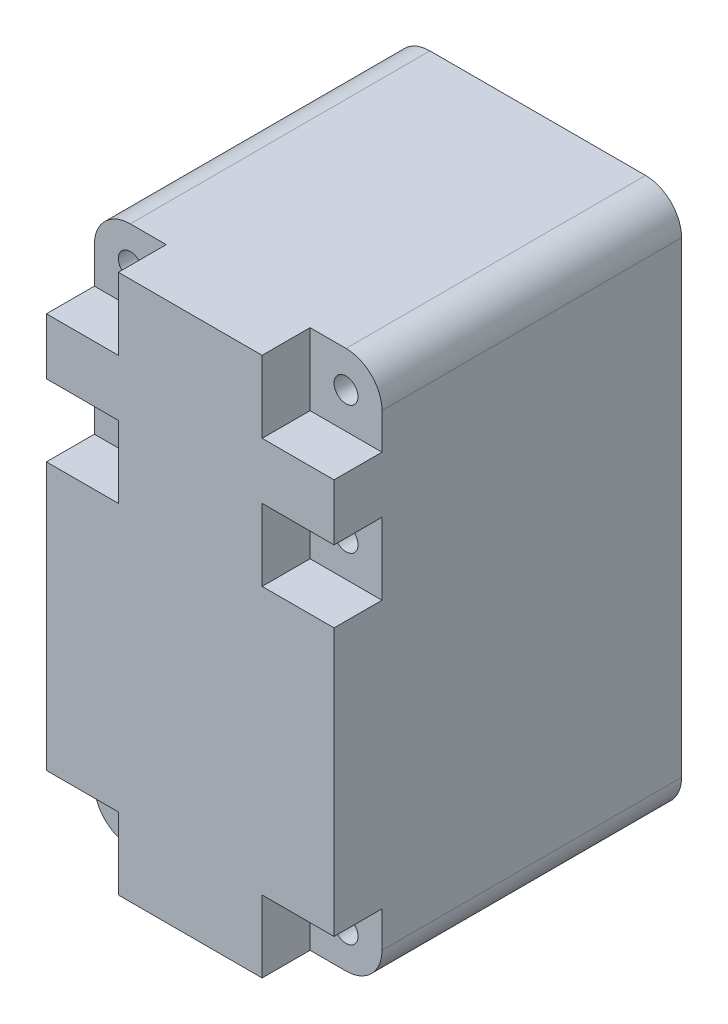
ISO-10303-21;
HEADER;
FILE_DESCRIPTION(('STEP AP214'),'2;1');
FILE_NAME('part.step','',(''),(''),'','','');
FILE_SCHEMA(('AUTOMOTIVE_DESIGN { 1 0 10303 214 1 1 1 1 }'));
ENDSEC;
DATA;
#1=APPLICATION_CONTEXT('core data for automotive mechanical design processes');
#2=APPLICATION_PROTOCOL_DEFINITION('international standard','automotive_design',2000,#1);
#3=PRODUCT_CONTEXT('',#1,'mechanical');
#4=PRODUCT('Part','Part','',(#3));
#5=PRODUCT_RELATED_PRODUCT_CATEGORY('part','',(#4));
#6=PRODUCT_DEFINITION_FORMATION('','',#4);
#7=PRODUCT_DEFINITION_CONTEXT('part definition',#1,'design');
#8=PRODUCT_DEFINITION('design','',#6,#7);
#9=PRODUCT_DEFINITION_SHAPE('','',#8);
#10=(LENGTH_UNIT() NAMED_UNIT(*) SI_UNIT(.MILLI.,.METRE.));
#11=(NAMED_UNIT(*) PLANE_ANGLE_UNIT() SI_UNIT($,.RADIAN.));
#12=(NAMED_UNIT(*) SI_UNIT($,.STERADIAN.) SOLID_ANGLE_UNIT());
#13=UNCERTAINTY_MEASURE_WITH_UNIT(LENGTH_MEASURE(1.E-05),#10,'distance_accuracy_value','');
#14=(GEOMETRIC_REPRESENTATION_CONTEXT(3) GLOBAL_UNCERTAINTY_ASSIGNED_CONTEXT((#13)) GLOBAL_UNIT_ASSIGNED_CONTEXT((#10,
#11,#12)) REPRESENTATION_CONTEXT('',''));
#15=CARTESIAN_POINT('',(0.,0.,0.));
#16=DIRECTION('',(0.,0.,1.));
#17=DIRECTION('',(1.,0.,0.));
#18=AXIS2_PLACEMENT_3D('',#15,#16,#17);
#19=CARTESIAN_POINT('',(-9.,-19.5,14.5));
#20=DIRECTION('',(0.,0.,-1.));
#21=DIRECTION('',(-1.,0.,0.));
#22=AXIS2_PLACEMENT_3D('',#19,#20,#21);
#23=CYLINDRICAL_SURFACE('',#22,3.);
#24=CARTESIAN_POINT('',(-9.,-19.5,10.5));
#25=DIRECTION('',(0.,0.,1.));
#26=DIRECTION('',(1.,0.,0.));
#27=AXIS2_PLACEMENT_3D('',#24,#25,#26);
#28=CIRCLE('',#27,3.);
#29=CARTESIAN_POINT('',(-12.0000000000002,-19.5,10.5));
#30=VERTEX_POINT('',#29);
#31=CARTESIAN_POINT('',(-8.99999999999998,-22.5,10.5));
#32=VERTEX_POINT('',#31);
#33=EDGE_CURVE('E275',#30,#32,#28,.T.);
#34=ORIENTED_EDGE('',*,*,#33,.F.);
#35=DIRECTION('',(0.,0.,-1.));
#36=VECTOR('',#35,1.);
#37=CARTESIAN_POINT('',(-12.,-19.5,14.5));
#38=LINE('',#37,#36);
#39=CARTESIAN_POINT('',(-12.,-19.5,-14.5));
#40=VERTEX_POINT('',#39);
#41=EDGE_CURVE('E422',#30,#40,#38,.T.);
#42=ORIENTED_EDGE('',*,*,#41,.T.);
#43=CARTESIAN_POINT('',(-9.,-19.5,-14.5));
#44=DIRECTION('',(0.,0.,1.));
#45=DIRECTION('',(1.,0.,0.));
#46=AXIS2_PLACEMENT_3D('',#43,#44,#45);
#47=CIRCLE('',#46,3.);
#48=CARTESIAN_POINT('',(-8.99999999999998,-22.5,-14.5));
#49=VERTEX_POINT('',#48);
#50=EDGE_CURVE('E409',#40,#49,#47,.T.);
#51=ORIENTED_EDGE('',*,*,#50,.T.);
#52=DIRECTION('',(0.,0.,-1.));
#53=VECTOR('',#52,1.);
#54=CARTESIAN_POINT('',(-8.99999999999998,-22.5,14.5));
#55=LINE('',#54,#53);
#56=EDGE_CURVE('E11',#32,#49,#55,.T.);
#57=ORIENTED_EDGE('',*,*,#56,.F.);
#58=EDGE_LOOP('',(#34,#42,#51,#57));
#59=FACE_BOUND('',#58,.T.);
#60=ADVANCED_FACE('F33',(#59),#23,.T.);
#61=CARTESIAN_POINT('',(9.,19.5,14.5));
#62=DIRECTION('',(0.,0.,-1.));
#63=DIRECTION('',(-1.,0.,0.));
#64=AXIS2_PLACEMENT_3D('',#61,#62,#63);
#65=CYLINDRICAL_SURFACE('',#64,3.);
#66=CARTESIAN_POINT('',(9.,19.5,10.5));
#67=DIRECTION('',(0.,0.,1.));
#68=DIRECTION('',(1.,0.,0.));
#69=AXIS2_PLACEMENT_3D('',#66,#67,#68);
#70=CIRCLE('',#69,3.);
#71=CARTESIAN_POINT('',(12.,19.5,10.5));
#72=VERTEX_POINT('',#71);
#73=CARTESIAN_POINT('',(8.99999999999998,22.5,10.5));
#74=VERTEX_POINT('',#73);
#75=EDGE_CURVE('E362',#72,#74,#70,.T.);
#76=ORIENTED_EDGE('',*,*,#75,.F.);
#77=DIRECTION('',(0.,0.,-1.));
#78=VECTOR('',#77,1.);
#79=CARTESIAN_POINT('',(12.,19.5,14.5));
#80=LINE('',#79,#78);
#81=CARTESIAN_POINT('',(12.,19.5,-14.5));
#82=VERTEX_POINT('',#81);
#83=EDGE_CURVE('E451',#72,#82,#80,.T.);
#84=ORIENTED_EDGE('',*,*,#83,.T.);
#85=CARTESIAN_POINT('',(9.,19.5,-14.5));
#86=DIRECTION('',(0.,0.,1.));
#87=DIRECTION('',(1.,0.,0.));
#88=AXIS2_PLACEMENT_3D('',#85,#86,#87);
#89=CIRCLE('',#88,3.);
#90=CARTESIAN_POINT('',(8.99999999999998,22.5,-14.5));
#91=VERTEX_POINT('',#90);
#92=EDGE_CURVE('E433',#82,#91,#89,.T.);
#93=ORIENTED_EDGE('',*,*,#92,.T.);
#94=DIRECTION('',(0.,0.,-1.));
#95=VECTOR('',#94,1.);
#96=CARTESIAN_POINT('',(8.99999999999998,22.5,14.5));
#97=LINE('',#96,#95);
#98=EDGE_CURVE('E449',#74,#91,#97,.T.);
#99=ORIENTED_EDGE('',*,*,#98,.F.);
#100=EDGE_LOOP('',(#76,#84,#93,#99));
#101=FACE_BOUND('',#100,.T.);
#102=ADVANCED_FACE('F486',(#101),#65,.T.);
#103=CARTESIAN_POINT('',(-8.99999999999998,-22.5,14.5));
#104=DIRECTION('',(0.,1.,0.));
#105=DIRECTION('',(0.,0.,1.));
#106=AXIS2_PLACEMENT_3D('',#103,#104,#105);
#107=PLANE('',#106);
#108=DIRECTION('',(1.,0.,0.));
#109=VECTOR('',#108,1.);
#110=CARTESIAN_POINT('',(12.,-22.5,10.5));
#111=LINE('',#110,#109);
#112=CARTESIAN_POINT('',(6.,-22.5,10.5));
#113=VERTEX_POINT('',#112);
#114=CARTESIAN_POINT('',(9.,-22.5,10.5));
#115=VERTEX_POINT('',#114);
#116=EDGE_CURVE('E235',#113,#115,#111,.T.);
#117=ORIENTED_EDGE('',*,*,#116,.F.);
#118=DIRECTION('',(0.,0.,1.));
#119=VECTOR('',#118,1.);
#120=CARTESIAN_POINT('',(6.,-22.5,10.5));
#121=LINE('',#120,#119);
#122=CARTESIAN_POINT('',(6.,-22.5,14.5));
#123=VERTEX_POINT('',#122);
#124=EDGE_CURVE('E220',#113,#123,#121,.T.);
#125=ORIENTED_EDGE('',*,*,#124,.T.);
#126=DIRECTION('',(1.,0.,0.));
#127=VECTOR('',#126,1.);
#128=CARTESIAN_POINT('',(-8.99999999999998,-22.5,14.5));
#129=LINE('',#128,#127);
#130=CARTESIAN_POINT('',(-5.99999999999977,-22.5,14.5));
#131=VERTEX_POINT('',#130);
#132=EDGE_CURVE('E410',#131,#123,#129,.T.);
#133=ORIENTED_EDGE('',*,*,#132,.F.);
#134=DIRECTION('',(0.,0.,1.));
#135=VECTOR('',#134,1.);
#136=CARTESIAN_POINT('',(-5.99999999999977,-22.5,10.5));
#137=LINE('',#136,#135);
#138=CARTESIAN_POINT('',(-5.99999999999977,-22.5,10.5));
#139=VERTEX_POINT('',#138);
#140=EDGE_CURVE('E268',#139,#131,#137,.T.);
#141=ORIENTED_EDGE('',*,*,#140,.F.);
#142=DIRECTION('',(1.,0.,0.));
#143=VECTOR('',#142,1.);
#144=CARTESIAN_POINT('',(-12.0000000000002,-22.5,10.5));
#145=LINE('',#144,#143);
#146=EDGE_CURVE('E263',#32,#139,#145,.T.);
#147=ORIENTED_EDGE('',*,*,#146,.F.);
#148=ORIENTED_EDGE('',*,*,#56,.T.);
#149=DIRECTION('',(1.,0.,0.));
#150=VECTOR('',#149,1.);
#151=CARTESIAN_POINT('',(-8.99999999999998,-22.5,-14.5));
#152=LINE('',#151,#150);
#153=CARTESIAN_POINT('',(8.99999999999998,-22.5,-14.5));
#154=VERTEX_POINT('',#153);
#155=EDGE_CURVE('E425',#49,#154,#152,.T.);
#156=ORIENTED_EDGE('',*,*,#155,.T.);
#157=DIRECTION('',(0.,0.,-1.));
#158=VECTOR('',#157,1.);
#159=CARTESIAN_POINT('',(8.99999999999998,-22.5,14.5));
#160=LINE('',#159,#158);
#161=EDGE_CURVE('E41',#115,#154,#160,.T.);
#162=ORIENTED_EDGE('',*,*,#161,.F.);
#163=EDGE_LOOP('',(#117,#125,#133,#141,#147,#148,#156,#162));
#164=FACE_BOUND('',#163,.T.);
#165=ADVANCED_FACE('F240',(#164),#107,.F.);
#166=CARTESIAN_POINT('',(9.,-19.5,14.5));
#167=DIRECTION('',(0.,0.,-1.));
#168=DIRECTION('',(-1.,0.,0.));
#169=AXIS2_PLACEMENT_3D('',#166,#167,#168);
#170=CYLINDRICAL_SURFACE('',#169,3.);
#171=DIRECTION('',(0.,0.,-1.));
#172=VECTOR('',#171,1.);
#173=CARTESIAN_POINT('',(12.,-19.5,14.5));
#174=LINE('',#173,#172);
#175=CARTESIAN_POINT('',(12.,-19.5,10.5));
#176=VERTEX_POINT('',#175);
#177=CARTESIAN_POINT('',(12.,-19.5,-14.5));
#178=VERTEX_POINT('',#177);
#179=EDGE_CURVE('E453',#176,#178,#174,.T.);
#180=ORIENTED_EDGE('',*,*,#179,.F.);
#181=CARTESIAN_POINT('',(9.,-19.5,10.5));
#182=DIRECTION('',(0.,0.,-1.));
#183=DIRECTION('',(-1.,0.,0.));
#184=AXIS2_PLACEMENT_3D('',#181,#182,#183);
#185=CIRCLE('',#184,3.);
#186=EDGE_CURVE('E252',#176,#115,#185,.T.);
#187=ORIENTED_EDGE('',*,*,#186,.T.);
#188=ORIENTED_EDGE('',*,*,#161,.T.);
#189=CARTESIAN_POINT('',(9.,-19.5,-14.5));
#190=DIRECTION('',(0.,0.,1.));
#191=DIRECTION('',(1.,0.,0.));
#192=AXIS2_PLACEMENT_3D('',#189,#190,#191);
#193=CIRCLE('',#192,3.);
#194=EDGE_CURVE('E427',#154,#178,#193,.T.);
#195=ORIENTED_EDGE('',*,*,#194,.T.);
#196=EDGE_LOOP('',(#180,#187,#188,#195));
#197=FACE_BOUND('',#196,.T.);
#198=ADVANCED_FACE('F564',(#197),#170,.T.);
#199=CARTESIAN_POINT('',(12.,-19.5,14.5));
#200=DIRECTION('',(-1.,0.,0.));
#201=DIRECTION('',(0.,0.,1.));
#202=AXIS2_PLACEMENT_3D('',#199,#200,#201);
#203=PLANE('',#202);
#204=DIRECTION('',(0.,1.,0.));
#205=VECTOR('',#204,1.);
#206=CARTESIAN_POINT('',(12.,-19.5,14.5));
#207=LINE('',#206,#205);
#208=CARTESIAN_POINT('',(12.,-16.5,14.5));
#209=VERTEX_POINT('',#208);
#210=CARTESIAN_POINT('',(12.,5.79999999999988,14.5));
#211=VERTEX_POINT('',#210);
#212=EDGE_CURVE('E414',#209,#211,#207,.T.);
#213=ORIENTED_EDGE('',*,*,#212,.F.);
#214=DIRECTION('',(0.,0.,1.));
#215=VECTOR('',#214,1.);
#216=CARTESIAN_POINT('',(12.,-16.5,10.5));
#217=LINE('',#216,#215);
#218=CARTESIAN_POINT('',(12.,-16.5,10.5));
#219=VERTEX_POINT('',#218);
#220=EDGE_CURVE('E49',#219,#209,#217,.T.);
#221=ORIENTED_EDGE('',*,*,#220,.F.);
#222=DIRECTION('',(0.,1.,0.));
#223=VECTOR('',#222,1.);
#224=CARTESIAN_POINT('',(12.,-16.5,10.5));
#225=LINE('',#224,#223);
#226=EDGE_CURVE('E242',#176,#219,#225,.T.);
#227=ORIENTED_EDGE('',*,*,#226,.F.);
#228=ORIENTED_EDGE('',*,*,#179,.T.);
#229=DIRECTION('',(0.,1.,0.));
#230=VECTOR('',#229,1.);
#231=CARTESIAN_POINT('',(12.,-19.5,-14.5));
#232=LINE('',#231,#230);
#233=EDGE_CURVE('E430',#178,#82,#232,.T.);
#234=ORIENTED_EDGE('',*,*,#233,.T.);
#235=ORIENTED_EDGE('',*,*,#83,.F.);
#236=DIRECTION('',(0.,1.,0.));
#237=VECTOR('',#236,1.);
#238=CARTESIAN_POINT('',(12.,16.4999999999998,10.5));
#239=LINE('',#238,#237);
#240=CARTESIAN_POINT('',(12.,16.4999999999998,10.5));
#241=VERTEX_POINT('',#240);
#242=EDGE_CURVE('E345',#241,#72,#239,.T.);
#243=ORIENTED_EDGE('',*,*,#242,.F.);
#244=DIRECTION('',(0.,0.,1.));
#245=VECTOR('',#244,1.);
#246=CARTESIAN_POINT('',(12.,16.4999999999998,10.5));
#247=LINE('',#246,#245);
#248=CARTESIAN_POINT('',(12.,16.4999999999998,14.5));
#249=VERTEX_POINT('',#248);
#250=EDGE_CURVE('E357',#241,#249,#247,.T.);
#251=ORIENTED_EDGE('',*,*,#250,.T.);
#252=CARTESIAN_POINT('',(12.,11.7999999999999,14.5));
#253=VERTEX_POINT('',#252);
#254=EDGE_CURVE('E412',#253,#249,#207,.T.);
#255=ORIENTED_EDGE('',*,*,#254,.F.);
#256=DIRECTION('',(0.,0.,1.));
#257=VECTOR('',#256,1.);
#258=CARTESIAN_POINT('',(12.,11.7999999999999,10.5));
#259=LINE('',#258,#257);
#260=CARTESIAN_POINT('',(12.,11.7999999999999,10.5));
#261=VERTEX_POINT('',#260);
#262=EDGE_CURVE('E320',#261,#253,#259,.T.);
#263=ORIENTED_EDGE('',*,*,#262,.F.);
#264=DIRECTION('',(0.,1.,0.));
#265=VECTOR('',#264,1.);
#266=CARTESIAN_POINT('',(12.,5.79999999999988,10.5));
#267=LINE('',#266,#265);
#268=CARTESIAN_POINT('',(12.,5.79999999999988,10.5));
#269=VERTEX_POINT('',#268);
#270=EDGE_CURVE('E307',#269,#261,#267,.T.);
#271=ORIENTED_EDGE('',*,*,#270,.F.);
#272=DIRECTION('',(0.,0.,1.));
#273=VECTOR('',#272,1.);
#274=CARTESIAN_POINT('',(12.,5.79999999999988,10.5));
#275=LINE('',#274,#273);
#276=EDGE_CURVE('E329',#269,#211,#275,.T.);
#277=ORIENTED_EDGE('',*,*,#276,.T.);
#278=EDGE_LOOP('',(#213,#221,#227,#228,#234,#235,#243,#251,#255,#263,#271,#277));
#279=FACE_BOUND('',#278,.T.);
#280=ADVANCED_FACE('F560',(#279),#203,.F.);
#281=CARTESIAN_POINT('',(-8.99999999999998,22.5,14.5));
#282=DIRECTION('',(0.,-1.,0.));
#283=DIRECTION('',(0.,0.,-1.));
#284=AXIS2_PLACEMENT_3D('',#281,#282,#283);
#285=PLANE('',#284);
#286=DIRECTION('',(-1.,0.,0.));
#287=VECTOR('',#286,1.);
#288=CARTESIAN_POINT('',(-8.99999999999998,22.5,14.5));
#289=LINE('',#288,#287);
#290=CARTESIAN_POINT('',(6.,22.5,14.5));
#291=VERTEX_POINT('',#290);
#292=CARTESIAN_POINT('',(-5.99999999999977,22.5,14.5));
#293=VERTEX_POINT('',#292);
#294=EDGE_CURVE('E416',#291,#293,#289,.T.);
#295=ORIENTED_EDGE('',*,*,#294,.F.);
#296=DIRECTION('',(0.,0.,1.));
#297=VECTOR('',#296,1.);
#298=CARTESIAN_POINT('',(6.,22.5,10.5));
#299=LINE('',#298,#297);
#300=CARTESIAN_POINT('',(6.,22.5,10.5));
#301=VERTEX_POINT('',#300);
#302=EDGE_CURVE('E354',#301,#291,#299,.T.);
#303=ORIENTED_EDGE('',*,*,#302,.F.);
#304=DIRECTION('',(-1.,0.,0.));
#305=VECTOR('',#304,1.);
#306=CARTESIAN_POINT('',(12.,22.5,10.5));
#307=LINE('',#306,#305);
#308=EDGE_CURVE('E347',#74,#301,#307,.T.);
#309=ORIENTED_EDGE('',*,*,#308,.F.);
#310=ORIENTED_EDGE('',*,*,#98,.T.);
#311=DIRECTION('',(-1.,0.,0.));
#312=VECTOR('',#311,1.);
#313=CARTESIAN_POINT('',(-8.99999999999998,22.5,-14.5));
#314=LINE('',#313,#312);
#315=CARTESIAN_POINT('',(-8.99999999999998,22.5,-14.5));
#316=VERTEX_POINT('',#315);
#317=EDGE_CURVE('E436',#91,#316,#314,.T.);
#318=ORIENTED_EDGE('',*,*,#317,.T.);
#319=DIRECTION('',(0.,0.,-1.));
#320=VECTOR('',#319,1.);
#321=CARTESIAN_POINT('',(-8.99999999999998,22.5,14.5));
#322=LINE('',#321,#320);
#323=CARTESIAN_POINT('',(-9.,22.5,10.5));
#324=VERTEX_POINT('',#323);
#325=EDGE_CURVE('E447',#324,#316,#322,.T.);
#326=ORIENTED_EDGE('',*,*,#325,.F.);
#327=DIRECTION('',(-1.,0.,0.));
#328=VECTOR('',#327,1.);
#329=CARTESIAN_POINT('',(-12.0000000000002,22.5,10.5));
#330=LINE('',#329,#328);
#331=CARTESIAN_POINT('',(-5.99999999999977,22.5,10.5));
#332=VERTEX_POINT('',#331);
#333=EDGE_CURVE('E368',#332,#324,#330,.T.);
#334=ORIENTED_EDGE('',*,*,#333,.F.);
#335=DIRECTION('',(0.,0.,1.));
#336=VECTOR('',#335,1.);
#337=CARTESIAN_POINT('',(-5.99999999999977,22.5,10.5));
#338=LINE('',#337,#336);
#339=EDGE_CURVE('E376',#332,#293,#338,.T.);
#340=ORIENTED_EDGE('',*,*,#339,.T.);
#341=EDGE_LOOP('',(#295,#303,#309,#310,#318,#326,#334,#340));
#342=FACE_BOUND('',#341,.T.);
#343=ADVANCED_FACE('F550',(#342),#285,.F.);
#344=CARTESIAN_POINT('',(-9.,19.5,14.5));
#345=DIRECTION('',(0.,0.,-1.));
#346=DIRECTION('',(-1.,0.,0.));
#347=AXIS2_PLACEMENT_3D('',#344,#345,#346);
#348=CYLINDRICAL_SURFACE('',#347,3.);
#349=DIRECTION('',(0.,0.,-1.));
#350=VECTOR('',#349,1.);
#351=CARTESIAN_POINT('',(-12.,19.5,14.5));
#352=LINE('',#351,#350);
#353=CARTESIAN_POINT('',(-12.0000000000002,19.5,10.5));
#354=VERTEX_POINT('',#353);
#355=CARTESIAN_POINT('',(-12.,19.5,-14.5));
#356=VERTEX_POINT('',#355);
#357=EDGE_CURVE('E445',#354,#356,#352,.T.);
#358=ORIENTED_EDGE('',*,*,#357,.F.);
#359=CARTESIAN_POINT('',(-9.,19.5,10.5));
#360=DIRECTION('',(0.,0.,-1.));
#361=DIRECTION('',(-1.,0.,0.));
#362=AXIS2_PLACEMENT_3D('',#359,#360,#361);
#363=CIRCLE('',#362,3.);
#364=EDGE_CURVE('E388',#354,#324,#363,.T.);
#365=ORIENTED_EDGE('',*,*,#364,.T.);
#366=ORIENTED_EDGE('',*,*,#325,.T.);
#367=CARTESIAN_POINT('',(-9.,19.5,-14.5));
#368=DIRECTION('',(0.,0.,1.));
#369=DIRECTION('',(-1.,0.,0.));
#370=AXIS2_PLACEMENT_3D('',#367,#368,#369);
#371=CIRCLE('',#370,3.);
#372=EDGE_CURVE('E439',#316,#356,#371,.T.);
#373=ORIENTED_EDGE('',*,*,#372,.T.);
#374=EDGE_LOOP('',(#358,#365,#366,#373));
#375=FACE_BOUND('',#374,.T.);
#376=ADVANCED_FACE('F547',(#375),#348,.T.);
#377=CARTESIAN_POINT('',(-12.,-19.5,14.5));
#378=DIRECTION('',(1.,0.,0.));
#379=DIRECTION('',(0.,0.,-1.));
#380=AXIS2_PLACEMENT_3D('',#377,#378,#379);
#381=PLANE('',#380);
#382=DIRECTION('',(0.,-1.,0.));
#383=VECTOR('',#382,1.);
#384=CARTESIAN_POINT('',(-12.0000000000002,-16.5,10.5));
#385=LINE('',#384,#383);
#386=CARTESIAN_POINT('',(-12.0000000000002,-16.5,10.5));
#387=VERTEX_POINT('',#386);
#388=EDGE_CURVE('E261',#387,#30,#385,.T.);
#389=ORIENTED_EDGE('',*,*,#388,.F.);
#390=DIRECTION('',(0.,0.,1.));
#391=VECTOR('',#390,1.);
#392=CARTESIAN_POINT('',(-12.0000000000002,-16.5,10.5));
#393=LINE('',#392,#391);
#394=CARTESIAN_POINT('',(-12.0000000000002,-16.5,14.5));
#395=VERTEX_POINT('',#394);
#396=EDGE_CURVE('E271',#387,#395,#393,.T.);
#397=ORIENTED_EDGE('',*,*,#396,.T.);
#398=DIRECTION('',(0.,-1.,0.));
#399=VECTOR('',#398,1.);
#400=CARTESIAN_POINT('',(-12.,-19.5,14.5));
#401=LINE('',#400,#399);
#402=CARTESIAN_POINT('',(-12.,5.79999999999988,14.5));
#403=VERTEX_POINT('',#402);
#404=EDGE_CURVE('E418',#403,#395,#401,.T.);
#405=ORIENTED_EDGE('',*,*,#404,.F.);
#406=DIRECTION('',(0.,0.,1.));
#407=VECTOR('',#406,1.);
#408=CARTESIAN_POINT('',(-12.,5.79999999999988,10.5));
#409=LINE('',#408,#407);
#410=CARTESIAN_POINT('',(-12.,5.79999999999988,10.5));
#411=VERTEX_POINT('',#410);
#412=EDGE_CURVE('E291',#411,#403,#409,.T.);
#413=ORIENTED_EDGE('',*,*,#412,.F.);
#414=DIRECTION('',(0.,-1.,0.));
#415=VECTOR('',#414,1.);
#416=CARTESIAN_POINT('',(-12.,5.79999999999988,10.5));
#417=LINE('',#416,#415);
#418=CARTESIAN_POINT('',(-12.,11.7999999999999,10.5));
#419=VERTEX_POINT('',#418);
#420=EDGE_CURVE('E278',#419,#411,#417,.T.);
#421=ORIENTED_EDGE('',*,*,#420,.F.);
#422=DIRECTION('',(0.,0.,1.));
#423=VECTOR('',#422,1.);
#424=CARTESIAN_POINT('',(-12.,11.7999999999999,10.5));
#425=LINE('',#424,#423);
#426=CARTESIAN_POINT('',(-12.,11.7999999999999,14.5));
#427=VERTEX_POINT('',#426);
#428=EDGE_CURVE('E298',#419,#427,#425,.T.);
#429=ORIENTED_EDGE('',*,*,#428,.T.);
#430=CARTESIAN_POINT('',(-12.,16.4999999999998,14.5));
#431=VERTEX_POINT('',#430);
#432=EDGE_CURVE('E419',#431,#427,#401,.T.);
#433=ORIENTED_EDGE('',*,*,#432,.F.);
#434=DIRECTION('',(0.,0.,1.));
#435=VECTOR('',#434,1.);
#436=CARTESIAN_POINT('',(-12.0000000000002,16.4999999999998,10.5));
#437=LINE('',#436,#435);
#438=CARTESIAN_POINT('',(-12.0000000000002,16.4999999999998,10.5));
#439=VERTEX_POINT('',#438);
#440=EDGE_CURVE('E384',#439,#431,#437,.T.);
#441=ORIENTED_EDGE('',*,*,#440,.F.);
#442=DIRECTION('',(0.,-1.,0.));
#443=VECTOR('',#442,1.);
#444=CARTESIAN_POINT('',(-12.0000000000002,16.4999999999998,10.5));
#445=LINE('',#444,#443);
#446=EDGE_CURVE('E371',#354,#439,#445,.T.);
#447=ORIENTED_EDGE('',*,*,#446,.F.);
#448=ORIENTED_EDGE('',*,*,#357,.T.);
#449=DIRECTION('',(0.,-1.,0.));
#450=VECTOR('',#449,1.);
#451=CARTESIAN_POINT('',(-12.,-19.5,-14.5));
#452=LINE('',#451,#450);
#453=EDGE_CURVE('E413',#356,#40,#452,.T.);
#454=ORIENTED_EDGE('',*,*,#453,.T.);
#455=ORIENTED_EDGE('',*,*,#41,.F.);
#456=EDGE_LOOP('',(#389,#397,#405,#413,#421,#429,#433,#441,#447,#448,#454,#455));
#457=FACE_BOUND('',#456,.T.);
#458=ADVANCED_FACE('F499',(#457),#381,.F.);
#459=CARTESIAN_POINT('',(-9.,-19.5,14.5));
#460=DIRECTION('',(0.,0.,1.));
#461=DIRECTION('',(1.,0.,0.));
#462=AXIS2_PLACEMENT_3D('',#459,#460,#461);
#463=PLANE('',#462);
#464=DIRECTION('',(0.,-1.,0.));
#465=VECTOR('',#464,1.);
#466=CARTESIAN_POINT('',(6.,-16.5,14.5));
#467=LINE('',#466,#465);
#468=CARTESIAN_POINT('',(6.,-16.5,14.5));
#469=VERTEX_POINT('',#468);
#470=EDGE_CURVE('E226',#469,#123,#467,.T.);
#471=ORIENTED_EDGE('',*,*,#470,.F.);
#472=DIRECTION('',(-1.,0.,0.));
#473=VECTOR('',#472,1.);
#474=CARTESIAN_POINT('',(12.,-16.5,14.5));
#475=LINE('',#474,#473);
#476=EDGE_CURVE('E237',#209,#469,#475,.T.);
#477=ORIENTED_EDGE('',*,*,#476,.F.);
#478=ORIENTED_EDGE('',*,*,#212,.T.);
#479=DIRECTION('',(1.,0.,0.));
#480=VECTOR('',#479,1.);
#481=CARTESIAN_POINT('',(6.,5.79999999999988,14.5));
#482=LINE('',#481,#480);
#483=CARTESIAN_POINT('',(6.,5.79999999999988,14.5));
#484=VERTEX_POINT('',#483);
#485=EDGE_CURVE('E311',#484,#211,#482,.T.);
#486=ORIENTED_EDGE('',*,*,#485,.F.);
#487=DIRECTION('',(0.,-1.,0.));
#488=VECTOR('',#487,1.);
#489=CARTESIAN_POINT('',(6.,5.79999999999988,14.5));
#490=LINE('',#489,#488);
#491=CARTESIAN_POINT('',(6.,11.7999999999999,14.5));
#492=VERTEX_POINT('',#491);
#493=EDGE_CURVE('E324',#492,#484,#490,.T.);
#494=ORIENTED_EDGE('',*,*,#493,.F.);
#495=DIRECTION('',(-1.,0.,0.));
#496=VECTOR('',#495,1.);
#497=CARTESIAN_POINT('',(6.,11.7999999999999,14.5));
#498=LINE('',#497,#496);
#499=EDGE_CURVE('E321',#253,#492,#498,.T.);
#500=ORIENTED_EDGE('',*,*,#499,.F.);
#501=ORIENTED_EDGE('',*,*,#254,.T.);
#502=DIRECTION('',(1.,0.,0.));
#503=VECTOR('',#502,1.);
#504=CARTESIAN_POINT('',(12.,16.4999999999998,14.5));
#505=LINE('',#504,#503);
#506=CARTESIAN_POINT('',(6.,16.4999999999998,14.5));
#507=VERTEX_POINT('',#506);
#508=EDGE_CURVE('E342',#507,#249,#505,.T.);
#509=ORIENTED_EDGE('',*,*,#508,.F.);
#510=DIRECTION('',(0.,-1.,0.));
#511=VECTOR('',#510,1.);
#512=CARTESIAN_POINT('',(6.,16.4999999999998,14.5));
#513=LINE('',#512,#511);
#514=EDGE_CURVE('E350',#291,#507,#513,.T.);
#515=ORIENTED_EDGE('',*,*,#514,.F.);
#516=ORIENTED_EDGE('',*,*,#294,.T.);
#517=DIRECTION('',(0.,1.,0.));
#518=VECTOR('',#517,1.);
#519=CARTESIAN_POINT('',(-5.99999999999977,16.4999999999998,14.5));
#520=LINE('',#519,#518);
#521=CARTESIAN_POINT('',(-5.99999999999977,16.4999999999998,14.5));
#522=VERTEX_POINT('',#521);
#523=EDGE_CURVE('E364',#522,#293,#520,.T.);
#524=ORIENTED_EDGE('',*,*,#523,.F.);
#525=DIRECTION('',(1.,0.,0.));
#526=VECTOR('',#525,1.);
#527=CARTESIAN_POINT('',(-12.0000000000002,16.4999999999998,14.5));
#528=LINE('',#527,#526);
#529=EDGE_CURVE('E369',#431,#522,#528,.T.);
#530=ORIENTED_EDGE('',*,*,#529,.F.);
#531=ORIENTED_EDGE('',*,*,#432,.T.);
#532=DIRECTION('',(-1.,0.,0.));
#533=VECTOR('',#532,1.);
#534=CARTESIAN_POINT('',(-5.99999999999977,11.7999999999999,14.5));
#535=LINE('',#534,#533);
#536=CARTESIAN_POINT('',(-5.99999999999977,11.7999999999999,14.5));
#537=VERTEX_POINT('',#536);
#538=EDGE_CURVE('E282',#537,#427,#535,.T.);
#539=ORIENTED_EDGE('',*,*,#538,.F.);
#540=DIRECTION('',(0.,1.,0.));
#541=VECTOR('',#540,1.);
#542=CARTESIAN_POINT('',(-5.99999999999977,5.79999999999988,14.5));
#543=LINE('',#542,#541);
#544=CARTESIAN_POINT('',(-5.99999999999977,5.79999999999988,14.5));
#545=VERTEX_POINT('',#544);
#546=EDGE_CURVE('E294',#545,#537,#543,.T.);
#547=ORIENTED_EDGE('',*,*,#546,.F.);
#548=DIRECTION('',(1.,0.,0.));
#549=VECTOR('',#548,1.);
#550=CARTESIAN_POINT('',(-5.99999999999977,5.79999999999988,14.5));
#551=LINE('',#550,#549);
#552=EDGE_CURVE('E277',#403,#545,#551,.T.);
#553=ORIENTED_EDGE('',*,*,#552,.F.);
#554=ORIENTED_EDGE('',*,*,#404,.T.);
#555=DIRECTION('',(-1.,0.,0.));
#556=VECTOR('',#555,1.);
#557=CARTESIAN_POINT('',(-12.0000000000002,-16.5,14.5));
#558=LINE('',#557,#556);
#559=CARTESIAN_POINT('',(-5.99999999999977,-16.5,14.5));
#560=VERTEX_POINT('',#559);
#561=EDGE_CURVE('E258',#560,#395,#558,.T.);
#562=ORIENTED_EDGE('',*,*,#561,.F.);
#563=DIRECTION('',(0.,1.,0.));
#564=VECTOR('',#563,1.);
#565=CARTESIAN_POINT('',(-5.99999999999977,-16.5,14.5));
#566=LINE('',#565,#564);
#567=EDGE_CURVE('E57',#131,#560,#566,.T.);
#568=ORIENTED_EDGE('',*,*,#567,.F.);
#569=ORIENTED_EDGE('',*,*,#132,.T.);
#570=EDGE_LOOP('',(#471,#477,#478,#486,#494,#500,#501,#509,#515,#516,#524,#530,#531,#539,#547,
#553,#554,#562,#568,#569));
#571=FACE_BOUND('',#570,.T.);
#572=ADVANCED_FACE('F521',(#571),#463,.T.);
#573=CARTESIAN_POINT('',(-9.,-19.5,-14.5));
#574=DIRECTION('',(0.,0.,1.));
#575=DIRECTION('',(1.,0.,0.));
#576=AXIS2_PLACEMENT_3D('',#573,#574,#575);
#577=PLANE('',#576);
#578=ORIENTED_EDGE('',*,*,#50,.F.);
#579=ORIENTED_EDGE('',*,*,#453,.F.);
#580=ORIENTED_EDGE('',*,*,#372,.F.);
#581=ORIENTED_EDGE('',*,*,#317,.F.);
#582=ORIENTED_EDGE('',*,*,#92,.F.);
#583=ORIENTED_EDGE('',*,*,#233,.F.);
#584=ORIENTED_EDGE('',*,*,#194,.F.);
#585=ORIENTED_EDGE('',*,*,#155,.F.);
#586=EDGE_LOOP('',(#578,#579,#580,#581,#582,#583,#584,#585));
#587=FACE_BOUND('',#586,.T.);
#588=ADVANCED_FACE('F507',(#587),#577,.F.);
#589=CARTESIAN_POINT('',(0.,0.,10.5));
#590=DIRECTION('',(0.,0.,-1.));
#591=DIRECTION('',(-1.,0.,0.));
#592=AXIS2_PLACEMENT_3D('',#589,#590,#591);
#593=PLANE('',#592);
#594=CARTESIAN_POINT('',(-9.,19.4999999999999,10.5));
#595=DIRECTION('',(0.,0.,-1.));
#596=DIRECTION('',(-1.,0.,0.));
#597=AXIS2_PLACEMENT_3D('',#594,#595,#596);
#598=CIRCLE('',#597,1.);
#599=CARTESIAN_POINT('',(-10.,19.4999999999999,10.5));
#600=VERTEX_POINT('',#599);
#601=EDGE_CURVE('E383',#600,#600,#598,.F.);
#602=ORIENTED_EDGE('',*,*,#601,.F.);
#603=EDGE_LOOP('',(#602));
#604=FACE_BOUND('',#603,.T.);
#605=ORIENTED_EDGE('',*,*,#446,.T.);
#606=DIRECTION('',(1.,0.,0.));
#607=VECTOR('',#606,1.);
#608=CARTESIAN_POINT('',(-12.0000000000002,16.4999999999998,10.5));
#609=LINE('',#608,#607);
#610=CARTESIAN_POINT('',(-5.99999999999977,16.4999999999998,10.5));
#611=VERTEX_POINT('',#610);
#612=EDGE_CURVE('E373',#439,#611,#609,.T.);
#613=ORIENTED_EDGE('',*,*,#612,.T.);
#614=DIRECTION('',(0.,1.,0.));
#615=VECTOR('',#614,1.);
#616=CARTESIAN_POINT('',(-5.99999999999977,16.4999999999998,10.5));
#617=LINE('',#616,#615);
#618=EDGE_CURVE('E365',#611,#332,#617,.T.);
#619=ORIENTED_EDGE('',*,*,#618,.T.);
#620=ORIENTED_EDGE('',*,*,#333,.T.);
#621=ORIENTED_EDGE('',*,*,#364,.F.);
#622=EDGE_LOOP('',(#605,#613,#619,#620,#621));
#623=FACE_BOUND('',#622,.T.);
#624=ADVANCED_FACE('F543',(#604,#623),#593,.F.);
#625=CARTESIAN_POINT('',(-5.99999999999977,16.4999999999998,10.5));
#626=DIRECTION('',(1.,0.,0.));
#627=DIRECTION('',(0.,0.,-1.));
#628=AXIS2_PLACEMENT_3D('',#625,#626,#627);
#629=PLANE('',#628);
#630=ORIENTED_EDGE('',*,*,#523,.T.);
#631=ORIENTED_EDGE('',*,*,#339,.F.);
#632=ORIENTED_EDGE('',*,*,#618,.F.);
#633=DIRECTION('',(0.,0.,1.));
#634=VECTOR('',#633,1.);
#635=CARTESIAN_POINT('',(-5.99999999999977,16.4999999999998,10.5));
#636=LINE('',#635,#634);
#637=EDGE_CURVE('E381',#611,#522,#636,.T.);
#638=ORIENTED_EDGE('',*,*,#637,.T.);
#639=EDGE_LOOP('',(#630,#631,#632,#638));
#640=FACE_BOUND('',#639,.T.);
#641=ADVANCED_FACE('F591',(#640),#629,.F.);
#642=CARTESIAN_POINT('',(-12.0000000000002,16.4999999999998,10.5));
#643=DIRECTION('',(0.,-1.,0.));
#644=DIRECTION('',(0.,0.,-1.));
#645=AXIS2_PLACEMENT_3D('',#642,#643,#644);
#646=PLANE('',#645);
#647=ORIENTED_EDGE('',*,*,#529,.T.);
#648=ORIENTED_EDGE('',*,*,#637,.F.);
#649=ORIENTED_EDGE('',*,*,#612,.F.);
#650=ORIENTED_EDGE('',*,*,#440,.T.);
#651=EDGE_LOOP('',(#647,#648,#649,#650));
#652=FACE_BOUND('',#651,.T.);
#653=ADVANCED_FACE('F540',(#652),#646,.F.);
#654=CARTESIAN_POINT('',(-9.,19.4999999999999,5.5));
#655=DIRECTION('',(0.,0.,1.));
#656=DIRECTION('',(1.,0.,0.));
#657=AXIS2_PLACEMENT_3D('',#654,#655,#656);
#658=PLANE('',#657);
#659=CARTESIAN_POINT('',(-9.,19.4999999999999,5.5));
#660=DIRECTION('',(0.,0.,1.));
#661=DIRECTION('',(1.,0.,0.));
#662=AXIS2_PLACEMENT_3D('',#659,#660,#661);
#663=CIRCLE('',#662,1.);
#664=CARTESIAN_POINT('',(-8.,19.4999999999999,5.5));
#665=VERTEX_POINT('',#664);
#666=EDGE_CURVE('E397',#665,#665,#663,.T.);
#667=ORIENTED_EDGE('',*,*,#666,.T.);
#668=EDGE_LOOP('',(#667));
#669=FACE_BOUND('',#668,.T.);
#670=ADVANCED_FACE('F598',(#669),#658,.T.);
#671=CARTESIAN_POINT('',(-9.,19.4999999999999,5.5));
#672=DIRECTION('',(0.,0.,1.));
#673=DIRECTION('',(1.,0.,0.));
#674=AXIS2_PLACEMENT_3D('',#671,#672,#673);
#675=CYLINDRICAL_SURFACE('',#674,1.);
#676=ORIENTED_EDGE('',*,*,#601,.T.);
#677=EDGE_LOOP('',(#676));
#678=FACE_BOUND('',#677,.T.);
#679=ORIENTED_EDGE('',*,*,#666,.F.);
#680=EDGE_LOOP('',(#679));
#681=FACE_BOUND('',#680,.T.);
#682=ADVANCED_FACE('F622',(#678,#681),#675,.F.);
#683=CARTESIAN_POINT('',(0.,0.,10.5));
#684=DIRECTION('',(0.,0.,1.));
#685=DIRECTION('',(1.,0.,0.));
#686=AXIS2_PLACEMENT_3D('',#683,#684,#685);
#687=PLANE('',#686);
#688=CARTESIAN_POINT('',(9.,19.5,10.5));
#689=DIRECTION('',(0.,0.,1.));
#690=DIRECTION('',(1.,0.,0.));
#691=AXIS2_PLACEMENT_3D('',#688,#689,#690);
#692=CIRCLE('',#691,1.);
#693=CARTESIAN_POINT('',(10.,19.5,10.5));
#694=VERTEX_POINT('',#693);
#695=EDGE_CURVE('E356',#694,#694,#692,.F.);
#696=ORIENTED_EDGE('',*,*,#695,.T.);
#697=EDGE_LOOP('',(#696));
#698=FACE_BOUND('',#697,.T.);
#699=ORIENTED_EDGE('',*,*,#75,.T.);
#700=ORIENTED_EDGE('',*,*,#308,.T.);
#701=DIRECTION('',(0.,-1.,0.));
#702=VECTOR('',#701,1.);
#703=CARTESIAN_POINT('',(6.,16.4999999999998,10.5));
#704=LINE('',#703,#702);
#705=CARTESIAN_POINT('',(6.,16.4999999999998,10.5));
#706=VERTEX_POINT('',#705);
#707=EDGE_CURVE('E338',#301,#706,#704,.T.);
#708=ORIENTED_EDGE('',*,*,#707,.T.);
#709=DIRECTION('',(1.,0.,0.));
#710=VECTOR('',#709,1.);
#711=CARTESIAN_POINT('',(12.,16.4999999999998,10.5));
#712=LINE('',#711,#710);
#713=EDGE_CURVE('E341',#706,#241,#712,.T.);
#714=ORIENTED_EDGE('',*,*,#713,.T.);
#715=ORIENTED_EDGE('',*,*,#242,.T.);
#716=EDGE_LOOP('',(#699,#700,#708,#714,#715));
#717=FACE_BOUND('',#716,.T.);
#718=ADVANCED_FACE('F584',(#698,#717),#687,.T.);
#719=CARTESIAN_POINT('',(6.,16.4999999999998,10.5));
#720=DIRECTION('',(-1.,0.,0.));
#721=DIRECTION('',(0.,0.,1.));
#722=AXIS2_PLACEMENT_3D('',#719,#720,#721);
#723=PLANE('',#722);
#724=ORIENTED_EDGE('',*,*,#514,.T.);
#725=DIRECTION('',(0.,0.,1.));
#726=VECTOR('',#725,1.);
#727=CARTESIAN_POINT('',(6.,16.4999999999998,10.5));
#728=LINE('',#727,#726);
#729=EDGE_CURVE('E349',#706,#507,#728,.T.);
#730=ORIENTED_EDGE('',*,*,#729,.F.);
#731=ORIENTED_EDGE('',*,*,#707,.F.);
#732=ORIENTED_EDGE('',*,*,#302,.T.);
#733=EDGE_LOOP('',(#724,#730,#731,#732));
#734=FACE_BOUND('',#733,.T.);
#735=ADVANCED_FACE('F588',(#734),#723,.F.);
#736=CARTESIAN_POINT('',(12.,16.4999999999998,10.5));
#737=DIRECTION('',(0.,-1.,0.));
#738=DIRECTION('',(0.,0.,-1.));
#739=AXIS2_PLACEMENT_3D('',#736,#737,#738);
#740=PLANE('',#739);
#741=ORIENTED_EDGE('',*,*,#508,.T.);
#742=ORIENTED_EDGE('',*,*,#250,.F.);
#743=ORIENTED_EDGE('',*,*,#713,.F.);
#744=ORIENTED_EDGE('',*,*,#729,.T.);
#745=EDGE_LOOP('',(#741,#742,#743,#744));
#746=FACE_BOUND('',#745,.T.);
#747=ADVANCED_FACE('F582',(#746),#740,.F.);
#748=CARTESIAN_POINT('',(9.,19.5,5.5));
#749=DIRECTION('',(0.,0.,1.));
#750=DIRECTION('',(1.,0.,0.));
#751=AXIS2_PLACEMENT_3D('',#748,#749,#750);
#752=PLANE('',#751);
#753=CARTESIAN_POINT('',(9.,19.5,5.5));
#754=DIRECTION('',(0.,0.,1.));
#755=DIRECTION('',(1.,0.,0.));
#756=AXIS2_PLACEMENT_3D('',#753,#754,#755);
#757=CIRCLE('',#756,1.);
#758=CARTESIAN_POINT('',(10.,19.5,5.5));
#759=VERTEX_POINT('',#758);
#760=EDGE_CURVE('E406',#759,#759,#757,.T.);
#761=ORIENTED_EDGE('',*,*,#760,.T.);
#762=EDGE_LOOP('',(#761));
#763=FACE_BOUND('',#762,.T.);
#764=ADVANCED_FACE('F785',(#763),#752,.T.);
#765=CARTESIAN_POINT('',(9.,19.5,5.5));
#766=DIRECTION('',(0.,0.,1.));
#767=DIRECTION('',(1.,0.,0.));
#768=AXIS2_PLACEMENT_3D('',#765,#766,#767);
#769=CYLINDRICAL_SURFACE('',#768,1.);
#770=ORIENTED_EDGE('',*,*,#760,.F.);
#771=EDGE_LOOP('',(#770));
#772=FACE_BOUND('',#771,.T.);
#773=ORIENTED_EDGE('',*,*,#695,.F.);
#774=EDGE_LOOP('',(#773));
#775=FACE_BOUND('',#774,.T.);
#776=ADVANCED_FACE('F774',(#772,#775),#769,.F.);
#777=CARTESIAN_POINT('',(0.,0.,10.5));
#778=DIRECTION('',(0.,0.,-1.));
#779=DIRECTION('',(-1.,0.,0.));
#780=AXIS2_PLACEMENT_3D('',#777,#778,#779);
#781=PLANE('',#780);
#782=ORIENTED_EDGE('',*,*,#270,.T.);
#783=DIRECTION('',(-1.,0.,0.));
#784=VECTOR('',#783,1.);
#785=CARTESIAN_POINT('',(6.,11.7999999999999,10.5));
#786=LINE('',#785,#784);
#787=CARTESIAN_POINT('',(6.,11.7999999999999,10.5));
#788=VERTEX_POINT('',#787);
#789=EDGE_CURVE('E310',#261,#788,#786,.T.);
#790=ORIENTED_EDGE('',*,*,#789,.T.);
#791=DIRECTION('',(0.,-1.,0.));
#792=VECTOR('',#791,1.);
#793=CARTESIAN_POINT('',(6.,5.79999999999988,10.5));
#794=LINE('',#793,#792);
#795=CARTESIAN_POINT('',(6.,5.79999999999988,10.5));
#796=VERTEX_POINT('',#795);
#797=EDGE_CURVE('E314',#788,#796,#794,.T.);
#798=ORIENTED_EDGE('',*,*,#797,.T.);
#799=DIRECTION('',(1.,0.,0.));
#800=VECTOR('',#799,1.);
#801=CARTESIAN_POINT('',(6.,5.79999999999988,10.5));
#802=LINE('',#801,#800);
#803=EDGE_CURVE('E317',#796,#269,#802,.T.);
#804=ORIENTED_EDGE('',*,*,#803,.T.);
#805=EDGE_LOOP('',(#782,#790,#798,#804));
#806=FACE_BOUND('',#805,.T.);
#807=CARTESIAN_POINT('',(9.00000000000011,8.80000000000001,10.5));
#808=DIRECTION('',(0.,0.,-1.));
#809=DIRECTION('',(-1.,0.,0.));
#810=AXIS2_PLACEMENT_3D('',#807,#808,#809);
#811=CIRCLE('',#810,1.);
#812=CARTESIAN_POINT('',(8.00000000000011,8.80000000000001,10.5));
#813=VERTEX_POINT('',#812);
#814=EDGE_CURVE('E332',#813,#813,#811,.F.);
#815=ORIENTED_EDGE('',*,*,#814,.F.);
#816=EDGE_LOOP('',(#815));
#817=FACE_BOUND('',#816,.T.);
#818=ADVANCED_FACE('F765',(#806,#817),#781,.F.);
#819=CARTESIAN_POINT('',(6.,5.79999999999988,10.5));
#820=DIRECTION('',(0.,-1.,0.));
#821=DIRECTION('',(0.,0.,-1.));
#822=AXIS2_PLACEMENT_3D('',#819,#820,#821);
#823=PLANE('',#822);
#824=ORIENTED_EDGE('',*,*,#485,.T.);
#825=ORIENTED_EDGE('',*,*,#276,.F.);
#826=ORIENTED_EDGE('',*,*,#803,.F.);
#827=DIRECTION('',(0.,0.,1.));
#828=VECTOR('',#827,1.);
#829=CARTESIAN_POINT('',(6.,5.79999999999988,10.5));
#830=LINE('',#829,#828);
#831=EDGE_CURVE('E333',#796,#484,#830,.T.);
#832=ORIENTED_EDGE('',*,*,#831,.T.);
#833=EDGE_LOOP('',(#824,#825,#826,#832));
#834=FACE_BOUND('',#833,.T.);
#835=ADVANCED_FACE('F570',(#834),#823,.F.);
#836=CARTESIAN_POINT('',(6.,5.79999999999988,10.5));
#837=DIRECTION('',(-1.,0.,0.));
#838=DIRECTION('',(0.,0.,1.));
#839=AXIS2_PLACEMENT_3D('',#836,#837,#838);
#840=PLANE('',#839);
#841=ORIENTED_EDGE('',*,*,#493,.T.);
#842=ORIENTED_EDGE('',*,*,#831,.F.);
#843=ORIENTED_EDGE('',*,*,#797,.F.);
#844=DIRECTION('',(0.,0.,1.));
#845=VECTOR('',#844,1.);
#846=CARTESIAN_POINT('',(6.,11.7999999999999,10.5));
#847=LINE('',#846,#845);
#848=EDGE_CURVE('E335',#788,#492,#847,.T.);
#849=ORIENTED_EDGE('',*,*,#848,.T.);
#850=EDGE_LOOP('',(#841,#842,#843,#849));
#851=FACE_BOUND('',#850,.T.);
#852=ADVANCED_FACE('F574',(#851),#840,.F.);
#853=CARTESIAN_POINT('',(6.,11.7999999999999,10.5));
#854=DIRECTION('',(0.,1.,0.));
#855=DIRECTION('',(0.,0.,1.));
#856=AXIS2_PLACEMENT_3D('',#853,#854,#855);
#857=PLANE('',#856);
#858=ORIENTED_EDGE('',*,*,#499,.T.);
#859=ORIENTED_EDGE('',*,*,#848,.F.);
#860=ORIENTED_EDGE('',*,*,#789,.F.);
#861=ORIENTED_EDGE('',*,*,#262,.T.);
#862=EDGE_LOOP('',(#858,#859,#860,#861));
#863=FACE_BOUND('',#862,.T.);
#864=ADVANCED_FACE('F607',(#863),#857,.F.);
#865=CARTESIAN_POINT('',(9.00000000000011,8.80000000000001,5.5));
#866=DIRECTION('',(0.,0.,1.));
#867=DIRECTION('',(1.,0.,0.));
#868=AXIS2_PLACEMENT_3D('',#865,#866,#867);
#869=PLANE('',#868);
#870=CARTESIAN_POINT('',(9.00000000000011,8.80000000000001,5.5));
#871=DIRECTION('',(0.,0.,1.));
#872=DIRECTION('',(1.,0.,0.));
#873=AXIS2_PLACEMENT_3D('',#870,#871,#872);
#874=CIRCLE('',#873,1.);
#875=CARTESIAN_POINT('',(10.0000000000001,8.80000000000001,5.5));
#876=VERTEX_POINT('',#875);
#877=EDGE_CURVE('E391',#876,#876,#874,.T.);
#878=ORIENTED_EDGE('',*,*,#877,.T.);
#879=EDGE_LOOP('',(#878));
#880=FACE_BOUND('',#879,.T.);
#881=ADVANCED_FACE('F603',(#880),#869,.T.);
#882=CARTESIAN_POINT('',(9.00000000000011,8.80000000000001,5.5));
#883=DIRECTION('',(0.,0.,1.));
#884=DIRECTION('',(1.,0.,0.));
#885=AXIS2_PLACEMENT_3D('',#882,#883,#884);
#886=CYLINDRICAL_SURFACE('',#885,1.);
#887=ORIENTED_EDGE('',*,*,#814,.T.);
#888=EDGE_LOOP('',(#887));
#889=FACE_BOUND('',#888,.T.);
#890=ORIENTED_EDGE('',*,*,#877,.F.);
#891=EDGE_LOOP('',(#890));
#892=FACE_BOUND('',#891,.T.);
#893=ADVANCED_FACE('F606',(#889,#892),#886,.F.);
#894=CARTESIAN_POINT('',(0.,0.,10.5));
#895=DIRECTION('',(0.,0.,1.));
#896=DIRECTION('',(1.,0.,0.));
#897=AXIS2_PLACEMENT_3D('',#894,#895,#896);
#898=PLANE('',#897);
#899=ORIENTED_EDGE('',*,*,#420,.T.);
#900=DIRECTION('',(1.,0.,0.));
#901=VECTOR('',#900,1.);
#902=CARTESIAN_POINT('',(-5.99999999999977,5.79999999999988,10.5));
#903=LINE('',#902,#901);
#904=CARTESIAN_POINT('',(-5.99999999999977,5.79999999999988,10.5));
#905=VERTEX_POINT('',#904);
#906=EDGE_CURVE('E281',#411,#905,#903,.T.);
#907=ORIENTED_EDGE('',*,*,#906,.T.);
#908=DIRECTION('',(0.,1.,0.));
#909=VECTOR('',#908,1.);
#910=CARTESIAN_POINT('',(-5.99999999999977,5.79999999999988,10.5));
#911=LINE('',#910,#909);
#912=CARTESIAN_POINT('',(-5.99999999999977,11.7999999999999,10.5));
#913=VERTEX_POINT('',#912);
#914=EDGE_CURVE('E285',#905,#913,#911,.T.);
#915=ORIENTED_EDGE('',*,*,#914,.T.);
#916=DIRECTION('',(-1.,0.,0.));
#917=VECTOR('',#916,1.);
#918=CARTESIAN_POINT('',(-5.99999999999977,11.7999999999999,10.5));
#919=LINE('',#918,#917);
#920=EDGE_CURVE('E288',#913,#419,#919,.T.);
#921=ORIENTED_EDGE('',*,*,#920,.T.);
#922=EDGE_LOOP('',(#899,#907,#915,#921));
#923=FACE_BOUND('',#922,.T.);
#924=CARTESIAN_POINT('',(-8.99999999999989,8.79999999999988,10.5));
#925=DIRECTION('',(0.,0.,1.));
#926=DIRECTION('',(1.,0.,0.));
#927=AXIS2_PLACEMENT_3D('',#924,#925,#926);
#928=CIRCLE('',#927,1.);
#929=CARTESIAN_POINT('',(-7.99999999999989,8.79999999999988,10.5));
#930=VERTEX_POINT('',#929);
#931=EDGE_CURVE('E301',#930,#930,#928,.F.);
#932=ORIENTED_EDGE('',*,*,#931,.T.);
#933=EDGE_LOOP('',(#932));
#934=FACE_BOUND('',#933,.T.);
#935=ADVANCED_FACE('F530',(#923,#934),#898,.T.);
#936=CARTESIAN_POINT('',(-5.99999999999977,11.7999999999999,10.5));
#937=DIRECTION('',(0.,1.,0.));
#938=DIRECTION('',(0.,0.,1.));
#939=AXIS2_PLACEMENT_3D('',#936,#937,#938);
#940=PLANE('',#939);
#941=ORIENTED_EDGE('',*,*,#538,.T.);
#942=ORIENTED_EDGE('',*,*,#428,.F.);
#943=ORIENTED_EDGE('',*,*,#920,.F.);
#944=DIRECTION('',(0.,0.,1.));
#945=VECTOR('',#944,1.);
#946=CARTESIAN_POINT('',(-5.99999999999977,11.7999999999999,10.5));
#947=LINE('',#946,#945);
#948=EDGE_CURVE('E302',#913,#537,#947,.T.);
#949=ORIENTED_EDGE('',*,*,#948,.T.);
#950=EDGE_LOOP('',(#941,#942,#943,#949));
#951=FACE_BOUND('',#950,.T.);
#952=ADVANCED_FACE('F534',(#951),#940,.F.);
#953=CARTESIAN_POINT('',(-5.99999999999977,5.79999999999988,10.5));
#954=DIRECTION('',(1.,0.,0.));
#955=DIRECTION('',(0.,0.,-1.));
#956=AXIS2_PLACEMENT_3D('',#953,#954,#955);
#957=PLANE('',#956);
#958=ORIENTED_EDGE('',*,*,#546,.T.);
#959=ORIENTED_EDGE('',*,*,#948,.F.);
#960=ORIENTED_EDGE('',*,*,#914,.F.);
#961=DIRECTION('',(0.,0.,1.));
#962=VECTOR('',#961,1.);
#963=CARTESIAN_POINT('',(-5.99999999999977,5.79999999999988,10.5));
#964=LINE('',#963,#962);
#965=EDGE_CURVE('E304',#905,#545,#964,.T.);
#966=ORIENTED_EDGE('',*,*,#965,.T.);
#967=EDGE_LOOP('',(#958,#959,#960,#966));
#968=FACE_BOUND('',#967,.T.);
#969=ADVANCED_FACE('F707',(#968),#957,.F.);
#970=CARTESIAN_POINT('',(-5.99999999999977,5.79999999999988,10.5));
#971=DIRECTION('',(0.,-1.,0.));
#972=DIRECTION('',(0.,0.,-1.));
#973=AXIS2_PLACEMENT_3D('',#970,#971,#972);
#974=PLANE('',#973);
#975=ORIENTED_EDGE('',*,*,#552,.T.);
#976=ORIENTED_EDGE('',*,*,#965,.F.);
#977=ORIENTED_EDGE('',*,*,#906,.F.);
#978=ORIENTED_EDGE('',*,*,#412,.T.);
#979=EDGE_LOOP('',(#975,#976,#977,#978));
#980=FACE_BOUND('',#979,.T.);
#981=ADVANCED_FACE('F525',(#980),#974,.F.);
#982=CARTESIAN_POINT('',(-8.99999999999989,8.79999999999988,5.5));
#983=DIRECTION('',(0.,0.,1.));
#984=DIRECTION('',(1.,0.,0.));
#985=AXIS2_PLACEMENT_3D('',#982,#983,#984);
#986=PLANE('',#985);
#987=CARTESIAN_POINT('',(-8.99999999999989,8.79999999999988,5.5));
#988=DIRECTION('',(0.,0.,1.));
#989=DIRECTION('',(1.,0.,0.));
#990=AXIS2_PLACEMENT_3D('',#987,#988,#989);
#991=CIRCLE('',#990,1.);
#992=CARTESIAN_POINT('',(-7.99999999999989,8.79999999999988,5.5));
#993=VERTEX_POINT('',#992);
#994=EDGE_CURVE('E394',#993,#993,#991,.T.);
#995=ORIENTED_EDGE('',*,*,#994,.T.);
#996=EDGE_LOOP('',(#995));
#997=FACE_BOUND('',#996,.T.);
#998=ADVANCED_FACE('F612',(#997),#986,.T.);
#999=CARTESIAN_POINT('',(-8.99999999999989,8.79999999999988,5.5));
#1000=DIRECTION('',(0.,0.,1.));
#1001=DIRECTION('',(1.,0.,0.));
#1002=AXIS2_PLACEMENT_3D('',#999,#1000,#1001);
#1003=CYLINDRICAL_SURFACE('',#1002,1.);
#1004=ORIENTED_EDGE('',*,*,#994,.F.);
#1005=EDGE_LOOP('',(#1004));
#1006=FACE_BOUND('',#1005,.T.);
#1007=ORIENTED_EDGE('',*,*,#931,.F.);
#1008=EDGE_LOOP('',(#1007));
#1009=FACE_BOUND('',#1008,.T.);
#1010=ADVANCED_FACE('F615',(#1006,#1009),#1003,.F.);
#1011=CARTESIAN_POINT('',(0.,0.,10.5));
#1012=DIRECTION('',(0.,0.,1.));
#1013=DIRECTION('',(1.,0.,0.));
#1014=AXIS2_PLACEMENT_3D('',#1011,#1012,#1013);
#1015=PLANE('',#1014);
#1016=CARTESIAN_POINT('',(-9.,-19.5,10.5));
#1017=DIRECTION('',(0.,0.,1.));
#1018=DIRECTION('',(1.,0.,0.));
#1019=AXIS2_PLACEMENT_3D('',#1016,#1017,#1018);
#1020=CIRCLE('',#1019,1.);
#1021=CARTESIAN_POINT('',(-8.,-19.5,10.5));
#1022=VERTEX_POINT('',#1021);
#1023=EDGE_CURVE('E270',#1022,#1022,#1020,.F.);
#1024=ORIENTED_EDGE('',*,*,#1023,.T.);
#1025=EDGE_LOOP('',(#1024));
#1026=FACE_BOUND('',#1025,.T.);
#1027=ORIENTED_EDGE('',*,*,#33,.T.);
#1028=ORIENTED_EDGE('',*,*,#146,.T.);
#1029=DIRECTION('',(0.,1.,0.));
#1030=VECTOR('',#1029,1.);
#1031=CARTESIAN_POINT('',(-5.99999999999977,-16.5,10.5));
#1032=LINE('',#1031,#1030);
#1033=CARTESIAN_POINT('',(-5.99999999999977,-16.5,10.5));
#1034=VERTEX_POINT('',#1033);
#1035=EDGE_CURVE('E254',#139,#1034,#1032,.T.);
#1036=ORIENTED_EDGE('',*,*,#1035,.T.);
#1037=DIRECTION('',(-1.,0.,0.));
#1038=VECTOR('',#1037,1.);
#1039=CARTESIAN_POINT('',(-12.0000000000002,-16.5,10.5));
#1040=LINE('',#1039,#1038);
#1041=EDGE_CURVE('E257',#1034,#387,#1040,.T.);
#1042=ORIENTED_EDGE('',*,*,#1041,.T.);
#1043=ORIENTED_EDGE('',*,*,#388,.T.);
#1044=EDGE_LOOP('',(#1027,#1028,#1036,#1042,#1043));
#1045=FACE_BOUND('',#1044,.T.);
#1046=ADVANCED_FACE('F466',(#1026,#1045),#1015,.T.);
#1047=CARTESIAN_POINT('',(-5.99999999999977,-16.5,10.5));
#1048=DIRECTION('',(1.,0.,0.));
#1049=DIRECTION('',(0.,0.,-1.));
#1050=AXIS2_PLACEMENT_3D('',#1047,#1048,#1049);
#1051=PLANE('',#1050);
#1052=ORIENTED_EDGE('',*,*,#567,.T.);
#1053=DIRECTION('',(0.,0.,1.));
#1054=VECTOR('',#1053,1.);
#1055=CARTESIAN_POINT('',(-5.99999999999977,-16.5,10.5));
#1056=LINE('',#1055,#1054);
#1057=EDGE_CURVE('E265',#1034,#560,#1056,.T.);
#1058=ORIENTED_EDGE('',*,*,#1057,.F.);
#1059=ORIENTED_EDGE('',*,*,#1035,.F.);
#1060=ORIENTED_EDGE('',*,*,#140,.T.);
#1061=EDGE_LOOP('',(#1052,#1058,#1059,#1060));
#1062=FACE_BOUND('',#1061,.T.);
#1063=ADVANCED_FACE('F512',(#1062),#1051,.F.);
#1064=CARTESIAN_POINT('',(-12.0000000000002,-16.5,10.5));
#1065=DIRECTION('',(0.,1.,0.));
#1066=DIRECTION('',(0.,0.,1.));
#1067=AXIS2_PLACEMENT_3D('',#1064,#1065,#1066);
#1068=PLANE('',#1067);
#1069=ORIENTED_EDGE('',*,*,#561,.T.);
#1070=ORIENTED_EDGE('',*,*,#396,.F.);
#1071=ORIENTED_EDGE('',*,*,#1041,.F.);
#1072=ORIENTED_EDGE('',*,*,#1057,.T.);
#1073=EDGE_LOOP('',(#1069,#1070,#1071,#1072));
#1074=FACE_BOUND('',#1073,.T.);
#1075=ADVANCED_FACE('F480',(#1074),#1068,.F.);
#1076=CARTESIAN_POINT('',(-9.,-19.5,5.5));
#1077=DIRECTION('',(0.,0.,1.));
#1078=DIRECTION('',(1.,0.,0.));
#1079=AXIS2_PLACEMENT_3D('',#1076,#1077,#1078);
#1080=PLANE('',#1079);
#1081=CARTESIAN_POINT('',(-9.,-19.5,5.5));
#1082=DIRECTION('',(0.,0.,1.));
#1083=DIRECTION('',(1.,0.,0.));
#1084=AXIS2_PLACEMENT_3D('',#1081,#1082,#1083);
#1085=CIRCLE('',#1084,1.);
#1086=CARTESIAN_POINT('',(-8.,-19.5,5.5));
#1087=VERTEX_POINT('',#1086);
#1088=EDGE_CURVE('E403',#1087,#1087,#1085,.T.);
#1089=ORIENTED_EDGE('',*,*,#1088,.T.);
#1090=EDGE_LOOP('',(#1089));
#1091=FACE_BOUND('',#1090,.T.);
#1092=ADVANCED_FACE('F471',(#1091),#1080,.T.);
#1093=CARTESIAN_POINT('',(-9.,-19.5,5.5));
#1094=DIRECTION('',(0.,0.,1.));
#1095=DIRECTION('',(1.,0.,0.));
#1096=AXIS2_PLACEMENT_3D('',#1093,#1094,#1095);
#1097=CYLINDRICAL_SURFACE('',#1096,1.);
#1098=ORIENTED_EDGE('',*,*,#1088,.F.);
#1099=EDGE_LOOP('',(#1098));
#1100=FACE_BOUND('',#1099,.T.);
#1101=ORIENTED_EDGE('',*,*,#1023,.F.);
#1102=EDGE_LOOP('',(#1101));
#1103=FACE_BOUND('',#1102,.T.);
#1104=ADVANCED_FACE('F469',(#1100,#1103),#1097,.F.);
#1105=CARTESIAN_POINT('',(0.,0.,10.5));
#1106=DIRECTION('',(0.,0.,-1.));
#1107=DIRECTION('',(-1.,0.,0.));
#1108=AXIS2_PLACEMENT_3D('',#1105,#1106,#1107);
#1109=PLANE('',#1108);
#1110=CARTESIAN_POINT('',(9.,-19.5,10.5));
#1111=DIRECTION('',(0.,0.,-1.));
#1112=DIRECTION('',(-1.,0.,0.));
#1113=AXIS2_PLACEMENT_3D('',#1110,#1111,#1112);
#1114=CIRCLE('',#1113,1.);
#1115=CARTESIAN_POINT('',(8.,-19.5,10.5));
#1116=VERTEX_POINT('',#1115);
#1117=EDGE_CURVE('E36',#1116,#1116,#1114,.F.);
#1118=ORIENTED_EDGE('',*,*,#1117,.F.);
#1119=EDGE_LOOP('',(#1118));
#1120=FACE_BOUND('',#1119,.T.);
#1121=ORIENTED_EDGE('',*,*,#226,.T.);
#1122=DIRECTION('',(-1.,0.,0.));
#1123=VECTOR('',#1122,1.);
#1124=CARTESIAN_POINT('',(12.,-16.5,10.5));
#1125=LINE('',#1124,#1123);
#1126=CARTESIAN_POINT('',(6.,-16.5,10.5));
#1127=VERTEX_POINT('',#1126);
#1128=EDGE_CURVE('E231',#219,#1127,#1125,.T.);
#1129=ORIENTED_EDGE('',*,*,#1128,.T.);
#1130=DIRECTION('',(0.,-1.,0.));
#1131=VECTOR('',#1130,1.);
#1132=CARTESIAN_POINT('',(6.,-16.5,10.5));
#1133=LINE('',#1132,#1131);
#1134=EDGE_CURVE('E223',#1127,#113,#1133,.T.);
#1135=ORIENTED_EDGE('',*,*,#1134,.T.);
#1136=ORIENTED_EDGE('',*,*,#116,.T.);
#1137=ORIENTED_EDGE('',*,*,#186,.F.);
#1138=EDGE_LOOP('',(#1121,#1129,#1135,#1136,#1137));
#1139=FACE_BOUND('',#1138,.T.);
#1140=ADVANCED_FACE('F234',(#1120,#1139),#1109,.F.);
#1141=CARTESIAN_POINT('',(6.,-16.5,10.5));
#1142=DIRECTION('',(-1.,0.,0.));
#1143=DIRECTION('',(0.,0.,1.));
#1144=AXIS2_PLACEMENT_3D('',#1141,#1142,#1143);
#1145=PLANE('',#1144);
#1146=ORIENTED_EDGE('',*,*,#470,.T.);
#1147=ORIENTED_EDGE('',*,*,#124,.F.);
#1148=ORIENTED_EDGE('',*,*,#1134,.F.);
#1149=DIRECTION('',(0.,0.,1.));
#1150=VECTOR('',#1149,1.);
#1151=CARTESIAN_POINT('',(6.,-16.5,10.5));
#1152=LINE('',#1151,#1150);
#1153=EDGE_CURVE('E249',#1127,#469,#1152,.T.);
#1154=ORIENTED_EDGE('',*,*,#1153,.T.);
#1155=EDGE_LOOP('',(#1146,#1147,#1148,#1154));
#1156=FACE_BOUND('',#1155,.T.);
#1157=ADVANCED_FACE('F222',(#1156),#1145,.F.);
#1158=CARTESIAN_POINT('',(12.,-16.5,10.5));
#1159=DIRECTION('',(0.,1.,0.));
#1160=DIRECTION('',(0.,0.,1.));
#1161=AXIS2_PLACEMENT_3D('',#1158,#1159,#1160);
#1162=PLANE('',#1161);
#1163=ORIENTED_EDGE('',*,*,#476,.T.);
#1164=ORIENTED_EDGE('',*,*,#1153,.F.);
#1165=ORIENTED_EDGE('',*,*,#1128,.F.);
#1166=ORIENTED_EDGE('',*,*,#220,.T.);
#1167=EDGE_LOOP('',(#1163,#1164,#1165,#1166));
#1168=FACE_BOUND('',#1167,.T.);
#1169=ADVANCED_FACE('F565',(#1168),#1162,.F.);
#1170=CARTESIAN_POINT('',(9.,-19.5,5.5));
#1171=DIRECTION('',(0.,0.,1.));
#1172=DIRECTION('',(1.,0.,0.));
#1173=AXIS2_PLACEMENT_3D('',#1170,#1171,#1172);
#1174=PLANE('',#1173);
#1175=CARTESIAN_POINT('',(9.,-19.5,5.5));
#1176=DIRECTION('',(0.,0.,1.));
#1177=DIRECTION('',(1.,0.,0.));
#1178=AXIS2_PLACEMENT_3D('',#1175,#1176,#1177);
#1179=CIRCLE('',#1178,1.);
#1180=CARTESIAN_POINT('',(10.,-19.5,5.5));
#1181=VERTEX_POINT('',#1180);
#1182=EDGE_CURVE('E400',#1181,#1181,#1179,.T.);
#1183=ORIENTED_EDGE('',*,*,#1182,.T.);
#1184=EDGE_LOOP('',(#1183));
#1185=FACE_BOUND('',#1184,.T.);
#1186=ADVANCED_FACE('F627',(#1185),#1174,.T.);
#1187=CARTESIAN_POINT('',(9.,-19.5,5.5));
#1188=DIRECTION('',(0.,0.,1.));
#1189=DIRECTION('',(1.,0.,0.));
#1190=AXIS2_PLACEMENT_3D('',#1187,#1188,#1189);
#1191=CYLINDRICAL_SURFACE('',#1190,1.);
#1192=ORIENTED_EDGE('',*,*,#1117,.T.);
#1193=EDGE_LOOP('',(#1192));
#1194=FACE_BOUND('',#1193,.T.);
#1195=ORIENTED_EDGE('',*,*,#1182,.F.);
#1196=EDGE_LOOP('',(#1195));
#1197=FACE_BOUND('',#1196,.T.);
#1198=ADVANCED_FACE('F630',(#1194,#1197),#1191,.F.);
#1199=CLOSED_SHELL('',(#60,#102,#165,#198,#280,#343,#376,#458,#572,#588,#624,#641,#653,#670,
#682,#718,#735,#747,#764,#776,#818,#835,#852,#864,#881,#893,#935,#952,#969,#981,#998,#1010,
#1046,#1063,#1075,#1092,#1104,#1140,#1157,#1169,#1186,#1198));
#1200=MANIFOLD_SOLID_BREP('B2',#1199);
#1201=ADVANCED_BREP_SHAPE_REPRESENTATION('',(#18,#1200),#14);
#1202=SHAPE_DEFINITION_REPRESENTATION(#9,#1201);
ENDSEC;
END-ISO-10303-21;
